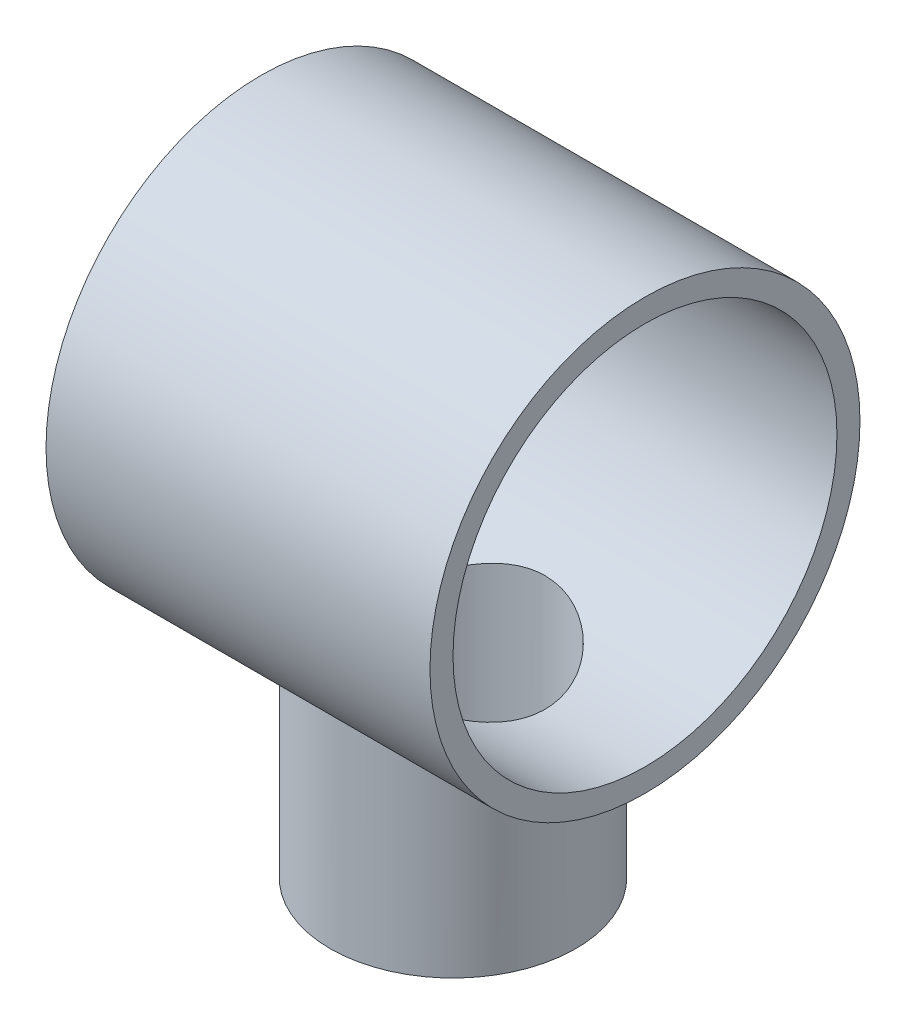
ISO-10303-21;
HEADER;
FILE_DESCRIPTION(('STEP AP214'),'2;1');
FILE_NAME('part.step','',(''),(''),'','','');
FILE_SCHEMA(('AUTOMOTIVE_DESIGN { 1 0 10303 214 1 1 1 1 }'));
ENDSEC;
DATA;
#1=APPLICATION_CONTEXT('core data for automotive mechanical design processes');
#2=APPLICATION_PROTOCOL_DEFINITION('international standard','automotive_design',2000,#1);
#3=PRODUCT_CONTEXT('',#1,'mechanical');
#4=PRODUCT('Part','Part','',(#3));
#5=PRODUCT_RELATED_PRODUCT_CATEGORY('part','',(#4));
#6=PRODUCT_DEFINITION_FORMATION('','',#4);
#7=PRODUCT_DEFINITION_CONTEXT('part definition',#1,'design');
#8=PRODUCT_DEFINITION('design','',#6,#7);
#9=PRODUCT_DEFINITION_SHAPE('','',#8);
#10=(LENGTH_UNIT() NAMED_UNIT(*) SI_UNIT(.MILLI.,.METRE.));
#11=(NAMED_UNIT(*) PLANE_ANGLE_UNIT() SI_UNIT($,.RADIAN.));
#12=(NAMED_UNIT(*) SI_UNIT($,.STERADIAN.) SOLID_ANGLE_UNIT());
#13=UNCERTAINTY_MEASURE_WITH_UNIT(LENGTH_MEASURE(1.E-05),#10,'distance_accuracy_value','');
#14=(GEOMETRIC_REPRESENTATION_CONTEXT(3) GLOBAL_UNCERTAINTY_ASSIGNED_CONTEXT((#13)) GLOBAL_UNIT_ASSIGNED_CONTEXT((#10,
#11,#12)) REPRESENTATION_CONTEXT('',''));
#15=CARTESIAN_POINT('',(0.,0.,0.));
#16=DIRECTION('',(0.,0.,1.));
#17=DIRECTION('',(1.,0.,0.));
#18=AXIS2_PLACEMENT_3D('',#15,#16,#17);
#19=CARTESIAN_POINT('',(12.5,15.,0.));
#20=DIRECTION('',(-1.,0.,0.));
#21=DIRECTION('',(0.,0.,1.));
#22=AXIS2_PLACEMENT_3D('',#19,#20,#21);
#23=CYLINDRICAL_SURFACE('',#22,12.5);
#24=CARTESIAN_POINT('',(-12.5,15.,0.));
#25=DIRECTION('',(1.,0.,0.));
#26=DIRECTION('',(0.,0.,-1.));
#27=AXIS2_PLACEMENT_3D('',#24,#25,#26);
#28=CIRCLE('',#27,12.5);
#29=CARTESIAN_POINT('',(-12.5,15.,-12.5));
#30=VERTEX_POINT('',#29);
#31=EDGE_CURVE('E93',#30,#30,#28,.T.);
#32=ORIENTED_EDGE('',*,*,#31,.F.);
#33=EDGE_LOOP('',(#32));
#34=FACE_BOUND('',#33,.T.);
#35=CARTESIAN_POINT('',(12.5,15.,0.));
#36=DIRECTION('',(1.,0.,0.));
#37=DIRECTION('',(0.,0.,-1.));
#38=AXIS2_PLACEMENT_3D('',#35,#36,#37);
#39=CIRCLE('',#38,12.5);
#40=CARTESIAN_POINT('',(12.5,15.,-12.5));
#41=VERTEX_POINT('',#40);
#42=EDGE_CURVE('E97',#41,#41,#39,.T.);
#43=ORIENTED_EDGE('',*,*,#42,.T.);
#44=EDGE_LOOP('',(#43));
#45=FACE_BOUND('',#44,.T.);
#46=CARTESIAN_POINT('',(0.,4.03414390026935,-6.));
#47=CARTESIAN_POINT('',(0.15735020462607,4.03414258662987,-5.9999989403592));
#48=CARTESIAN_POINT('',(0.314725323281396,4.03074545178164,-5.99380169491937));
#49=CARTESIAN_POINT('',(0.62828134733471,4.01727829153427,-5.96908835868027));
#50=CARTESIAN_POINT('',(0.784461596267611,4.00720483194597,-5.95056592799333));
#51=CARTESIAN_POINT('',(1.09463141883828,3.98073051054225,-5.90139633605082));
#52=CARTESIAN_POINT('',(1.24861675299921,3.96431877355168,-5.87072833318681));
#53=CARTESIAN_POINT('',(1.55308874631255,3.92573880903799,-5.79762400573589));
#54=CARTESIAN_POINT('',(1.7035738678318,3.9035681017771,-5.7551826111433));
#55=CARTESIAN_POINT('',(1.99922231074165,3.85433894593289,-5.65925128836182));
#56=CARTESIAN_POINT('',(2.14441024200026,3.82730789983292,-5.60582307265198));
#57=CARTESIAN_POINT('',(2.42954979976098,3.76909617352703,-5.48826947962813));
#58=CARTESIAN_POINT('',(2.5694993825369,3.73791389491042,-5.42413997941681));
#59=CARTESIAN_POINT('',(2.98028759703964,3.6394734410903,-5.21650106580777));
#60=CARTESIAN_POINT('',(3.24236804904727,3.56726833283627,-5.05764213495337));
#61=CARTESIAN_POINT('',(3.75692575927316,3.41122513087248,-4.68968805895476));
#62=CARTESIAN_POINT('',(4.00717460405046,3.32692019647806,-4.47770058325217));
#63=CARTESIAN_POINT('',(4.47040420543608,3.15990599648418,-4.01527636064614));
#64=CARTESIAN_POINT('',(4.68336756995255,3.07719749147101,-3.7648217721811));
#65=CARTESIAN_POINT('',(4.97662816777367,2.95806367588601,-3.3561404439229));
#66=CARTESIAN_POINT('',(5.0723081112677,2.91812142660984,-3.20973647251352));
#67=CARTESIAN_POINT('',(5.25088592279197,2.84206968239774,-2.90840580813487));
#68=CARTESIAN_POINT('',(5.33378883393528,2.80595867702705,-2.7534825106847));
#69=CARTESIAN_POINT('',(5.48600563947057,2.73861344985487,-2.43612706621973));
#70=CARTESIAN_POINT('',(5.55532260649822,2.70737812568157,-2.27369662733484));
#71=CARTESIAN_POINT('',(5.67962367137569,2.65070600181573,-1.94246064388774));
#72=CARTESIAN_POINT('',(5.7346091538641,2.62526864198179,-1.77365571700319));
#73=CARTESIAN_POINT('',(5.826405060529,2.58245349652283,-1.44241162227704));
#74=CARTESIAN_POINT('',(5.86417993521471,2.56465268360627,-1.28029410404222));
#75=CARTESIAN_POINT('',(5.92618388822962,2.53529351946516,-0.952936943564089));
#76=CARTESIAN_POINT('',(5.95041416789157,2.52373461462001,-0.78769757955608));
#77=CARTESIAN_POINT('',(5.98501257685932,2.50719628797283,-0.455519387831638));
#78=CARTESIAN_POINT('',(5.99538682662696,2.50221396118737,-0.288581343309991));
#79=CARTESIAN_POINT('',(6.00215372137931,2.49896648265721,0.0456393761256057));
#80=CARTESIAN_POINT('',(5.99854713571307,2.50070096129455,0.212922031569714));
#81=CARTESIAN_POINT('',(5.97825796713082,2.51042433268341,0.532946340185345));
#82=CARTESIAN_POINT('',(5.96265256140748,2.51789793695426,0.685773431575039));
#83=CARTESIAN_POINT('',(5.91983643540491,2.53829431925788,0.989474383570441));
#84=CARTESIAN_POINT('',(5.89262202438552,2.55121883023055,1.14034760727098));
#85=CARTESIAN_POINT('',(5.8268870747086,2.58219930718519,1.43901403468184));
#86=CARTESIAN_POINT('',(5.78837030408503,2.60025356292511,1.58680824732854));
#87=CARTESIAN_POINT('',(5.70039456377726,2.64107688093668,1.87848853904261));
#88=CARTESIAN_POINT('',(5.65093140948583,2.66384774607024,2.02237309983798));
#89=CARTESIAN_POINT('',(5.54073945498275,2.71393675191641,2.30735064119701));
#90=CARTESIAN_POINT('',(5.47986124645501,2.74131463899088,2.44837537939449));
#91=CARTESIAN_POINT('',(5.34782362295238,2.7997655230885,2.72475137236966));
#92=CARTESIAN_POINT('',(5.27666048254633,2.83083985832267,2.86010054831434));
#93=CARTESIAN_POINT('',(5.04852280088727,2.92860277505351,3.25657289688957));
#94=CARTESIAN_POINT('',(4.87683272874413,2.99986285519544,3.50829346273011));
#95=CARTESIAN_POINT('',(4.48181161499767,3.15513809245727,4.0028005901561));
#96=CARTESIAN_POINT('',(4.25524705226196,3.23972399066333,4.24280468345822));
#97=CARTESIAN_POINT('',(3.76539302870661,3.40795990378299,4.68296321169405));
#98=CARTESIAN_POINT('',(3.50207932947968,3.49160926132988,4.8830911325056));
#99=CARTESIAN_POINT('',(3.07607767123689,3.6117479406751,5.15444213727199));
#100=CARTESIAN_POINT('',(2.92453789825034,3.65186504702532,5.24193052670976));
#101=CARTESIAN_POINT('',(2.61359407813478,3.72799114778489,5.40368332335519));
#102=CARTESIAN_POINT('',(2.45419337013432,3.76400186531784,5.47795328467305));
#103=CARTESIAN_POINT('',(2.12860060881331,3.83059698579987,5.6124930249832));
#104=CARTESIAN_POINT('',(1.96241238098292,3.86118439482207,5.67277056556802));
#105=CARTESIAN_POINT('',(1.62436581887298,3.91574250864144,5.77864952753983));
#106=CARTESIAN_POINT('',(1.45250819494715,3.93971403888431,5.82425277991684));
#107=CARTESIAN_POINT('',(1.1179213473759,3.97846237464294,5.89722656483261));
#108=CARTESIAN_POINT('',(0.955503803238798,3.99380365227028,5.92572779475059));
#109=CARTESIAN_POINT('',(0.628369900268947,4.0173660938251,5.96928561814754));
#110=CARTESIAN_POINT('',(0.463653787593181,4.02558801431833,5.98434364022575));
#111=CARTESIAN_POINT('',(0.133416055698985,4.03457396457975,6.00079330547564));
#112=CARTESIAN_POINT('',(-0.032105139957409,4.0353415642635,6.00219149042094));
#113=CARTESIAN_POINT('',(-0.362556595830525,4.02939554927175,5.99131684178549));
#114=CARTESIAN_POINT('',(-0.527486888455427,4.02268235138381,5.9790447698338));
#115=CARTESIAN_POINT('',(-0.839366462674833,4.00305909519196,5.94286647113808));
#116=CARTESIAN_POINT('',(-0.986504817067181,3.99081503470986,5.92020747316513));
#117=CARTESIAN_POINT('',(-1.2781980435407,3.96085443779515,5.8641516929655));
#118=CARTESIAN_POINT('',(-1.4227520956408,3.94313619593543,5.83075156431293));
#119=CARTESIAN_POINT('',(-1.70833174204548,3.90277420250608,5.75356170859334));
#120=CARTESIAN_POINT('',(-1.84935783652694,3.88013115361543,5.7097734636378));
#121=CARTESIAN_POINT('',(-2.12715887479583,3.83057354278211,5.61221023485981));
#122=CARTESIAN_POINT('',(-2.26393214193383,3.80365732107518,5.55843136914396));
#123=CARTESIAN_POINT('',(-2.67918125236911,3.71492736599271,5.37733787957185));
#124=CARTESIAN_POINT('',(-2.94950225390146,3.64707127948246,5.23379477432826));
#125=CARTESIAN_POINT('',(-3.46356930881883,3.50281960490528,4.9088140325432));
#126=CARTESIAN_POINT('',(-3.70730186434111,3.42641971898942,4.72735728381324));
#127=CARTESIAN_POINT('',(-4.19069898944806,3.26311445540254,4.30717257677326));
#128=CARTESIAN_POINT('',(-4.4267157326711,3.17600626425688,4.0642695252742));
#129=CARTESIAN_POINT('',(-4.74821977691898,3.05069614967934,3.67193719708452));
#130=CARTESIAN_POINT('',(-4.85002570385915,3.00979217256557,3.53639517654306));
#131=CARTESIAN_POINT('',(-5.04212953563963,2.93080768352525,3.25663542499984));
#132=CARTESIAN_POINT('',(-5.13243236660451,2.89272596592658,3.11242144691999));
#133=CARTESIAN_POINT('',(-5.30245649091858,2.81968660411802,2.81320982661953));
#134=CARTESIAN_POINT('',(-5.38193634820776,2.7848046078058,2.65805646337679));
#135=CARTESIAN_POINT('',(-5.52738616675632,2.72002611871248,2.34061158696014));
#136=CARTESIAN_POINT('',(-5.59336206342739,2.69012743668706,2.17832324809829));
#137=CARTESIAN_POINT('',(-5.71108011912281,2.63619401478782,1.84778988524713));
#138=CARTESIAN_POINT('',(-5.76282835952442,2.6121567700376,1.67954744105962));
#139=CARTESIAN_POINT('',(-5.85147207077611,2.57067226939143,1.33840310803469));
#140=CARTESIAN_POINT('',(-5.88836913329155,2.55322430730576,1.1655017206368));
#141=CARTESIAN_POINT('',(-5.94426628654407,2.52667827795417,0.831739984168317));
#142=CARTESIAN_POINT('',(-5.96454345383424,2.51698615115047,0.671139677472094));
#143=CARTESIAN_POINT('',(-5.99205223543775,2.50381889630845,0.348575735762495));
#144=CARTESIAN_POINT('',(-5.99928472887483,2.50034334931438,0.186612193361238));
#145=CARTESIAN_POINT('',(-6.00061410915846,2.49970520827725,-0.137338693741288));
#146=CARTESIAN_POINT('',(-5.9947143063805,2.50254102327264,-0.299326022153729));
#147=CARTESIAN_POINT('',(-5.9698602432579,2.51444386337725,-0.622061977662451));
#148=CARTESIAN_POINT('',(-5.95090625534433,2.52351075844848,-0.782810630538171));
#149=CARTESIAN_POINT('',(-5.90164730665827,2.54692799667654,-1.0925722343886));
#150=CARTESIAN_POINT('',(-5.87206264345968,2.56094224978832,-1.24172602322374));
#151=CARTESIAN_POINT('',(-5.8018111212944,2.59395101516232,-1.53688358028895));
#152=CARTESIAN_POINT('',(-5.76114070631744,2.61294712539583,-1.68288632150236));
#153=CARTESIAN_POINT('',(-5.66911874453989,2.65547728554647,-1.97076512517666));
#154=CARTESIAN_POINT('',(-5.61777003428042,2.67901013022211,-2.11264227215943));
#155=CARTESIAN_POINT('',(-5.50483662515281,2.7300895424073,-2.39153591304959));
#156=CARTESIAN_POINT('',(-5.44324801340995,2.75763764372984,-2.52855052450365));
#157=CARTESIAN_POINT('',(-5.23793980565394,2.84803012801514,-2.94306911458783));
#158=CARTESIAN_POINT('',(-5.07772449605671,2.91668708637703,-3.21136402090248));
#159=CARTESIAN_POINT('',(-4.71921395006413,3.06290486167362,-3.71828223796427));
#160=CARTESIAN_POINT('',(-4.52090126857919,3.14046975105138,-3.95689187280019));
#161=CARTESIAN_POINT('',(-4.07049414406464,3.30508858643697,-4.42098007535831));
#162=CARTESIAN_POINT('',(-3.81512487482606,3.3923575034469,-4.64321301880738));
#163=CARTESIAN_POINT('',(-3.26880459586111,3.5602552875519,-5.04275327593884));
#164=CARTESIAN_POINT('',(-2.97782637035229,3.64087899598651,-5.22002590468109));
#165=CARTESIAN_POINT('',(-2.51665464445101,3.7500873489084,-5.44948094716765));
#166=CARTESIAN_POINT('',(-2.35701681681534,3.78483365899694,-5.52043095343247));
#167=CARTESIAN_POINT('',(-2.03121585120839,3.84874986659495,-5.64842816908365));
#168=CARTESIAN_POINT('',(-1.86505610352782,3.87792261631825,-5.70548249357618));
#169=CARTESIAN_POINT('',(-1.52785027504165,3.92947020162007,-5.80486878048079));
#170=CARTESIAN_POINT('',(-1.3568181694819,3.95186268494729,-5.84723900516207));
#171=CARTESIAN_POINT('',(-1.01097044741679,3.98897996729627,-5.91684094677842));
#172=CARTESIAN_POINT('',(-0.836157643260832,4.00371027460589,-5.9440835398224));
#173=CARTESIAN_POINT('',(-0.550800101530248,4.02086489980565,-5.97568127307846));
#174=CARTESIAN_POINT('',(-0.440908951821442,4.02583561794815,-5.98479428505624));
#175=CARTESIAN_POINT('',(-0.220682635552664,4.03247567245486,-5.99695419216154));
#176=CARTESIAN_POINT('',(-0.110347444155998,4.03414482150589,-6.00000074311091));
#177=CARTESIAN_POINT('',(0.,4.03414390026935,-6.));
#178=B_SPLINE_CURVE_WITH_KNOTS('',3,(#46,#47,#48,#49,#50,#51,#52,#53,#54,#55,#56,#57,#58,#59,
#60,#61,#62,#63,#64,#65,#66,#67,#68,#69,#70,#71,#72,#73,#74,#75,#76,#77,#78,#79,#80,#81,#82,#83,
#84,#85,#86,#87,#88,#89,#90,#91,#92,#93,#94,#95,#96,#97,#98,#99,#100,#101,#102,#103,#104,#105,
#106,#107,#108,#109,#110,#111,#112,#113,#114,#115,#116,#117,#118,#119,#120,#121,#122,#123,#124,
#125,#126,#127,#128,#129,#130,#131,#132,#133,#134,#135,#136,#137,#138,#139,#140,#141,#142,#143,
#144,#145,#146,#147,#148,#149,#150,#151,#152,#153,#154,#155,#156,#157,#158,#159,#160,#161,#162,
#163,#164,#165,#166,#167,#168,#169,#170,#171,#172,#173,#174,#175,#176,#177),.UNSPECIFIED.,.T.,
.F.,(4,2,2,2,2,2,2,2,2,2,2,2,2,2,2,2,2,2,2,2,2,2,2,2,2,2,2,2,2,2,2,2,2,2,2,2,2,2,2,2,2,2,2,2,2,
2,2,2,2,2,2,2,2,2,2,2,2,2,2,2,2,2,2,2,2,4),(0.,0.471936590147493,0.944116125143456,
1.41710944807336,1.89030677436769,2.36091541882663,2.83170579566572,3.77232944848345,
4.78415072006602,5.79644271304576,6.33405924599547,6.87146303446902,7.40874514157362,
7.94597531982624,8.44753067538701,8.94904153862282,9.45033080199234,9.95159248039024,
10.4124589956264,10.8734721390776,11.3343317620708,11.7953678687484,12.2629231066265,
12.7306481298597,13.6655405997409,14.683524718929,15.7021834650795,16.2401629947783,
16.7779159401748,17.3153698775199,17.8527567278132,18.3489008146548,18.8449921703721,
19.3408459334671,19.8366720717883,20.2842881949034,20.732043909255,21.1797357789998,
21.6276019663289,22.5639579194149,23.5007870313311,24.5446739907422,25.0673281518587,
25.589757731908,26.1224027734003,26.6548131956594,27.1869956928083,27.7191211384468,
28.2049834763956,28.6908130692503,29.1765202085596,29.6622172118322,30.119809042876,
30.5775478301311,31.0351651803853,31.492957799133,32.4484547466443,33.4043902712219,
34.4485727225206,35.4935582818586,36.0272882712014,36.5607443936444,37.0927998531633,
37.6244722910452,37.9554158848919,38.2863782541512),.UNSPECIFIED.);
#179=CARTESIAN_POINT('',(0.,4.03414390026935,-6.));
#180=VERTEX_POINT('',#179);
#181=EDGE_CURVE('E40',#180,#180,#178,.T.);
#182=ORIENTED_EDGE('',*,*,#181,.T.);
#183=EDGE_LOOP('',(#182));
#184=FACE_BOUND('',#183,.T.);
#185=ADVANCED_FACE('F35',(#34,#45,#184),#23,.F.);
#186=CARTESIAN_POINT('',(0.,-10.,0.));
#187=DIRECTION('',(0.,1.,0.));
#188=DIRECTION('',(0.,0.,1.));
#189=AXIS2_PLACEMENT_3D('',#186,#187,#188);
#190=CYLINDRICAL_SURFACE('',#189,8.);
#191=CARTESIAN_POINT('',(0.,-10.,0.));
#192=DIRECTION('',(0.,1.,0.));
#193=DIRECTION('',(0.,0.,1.));
#194=AXIS2_PLACEMENT_3D('',#191,#192,#193);
#195=CIRCLE('',#194,8.);
#196=CARTESIAN_POINT('',(0.,-10.,8.));
#197=VERTEX_POINT('',#196);
#198=EDGE_CURVE('E10',#197,#197,#195,.T.);
#199=ORIENTED_EDGE('',*,*,#198,.T.);
#200=EDGE_LOOP('',(#199));
#201=FACE_BOUND('',#200,.T.);
#202=CARTESIAN_POINT('',(0.,3.51087470692394,8.));
#203=CARTESIAN_POINT('',(-0.203532053407668,3.51087379464103,7.99999935787318));
#204=CARTESIAN_POINT('',(-0.407073236896617,3.50544619430501,7.99222093739566));
#205=CARTESIAN_POINT('',(-0.812412823952546,3.48396610627577,7.96123805270269));
#206=CARTESIAN_POINT('',(-1.01421110702202,3.46791288983113,7.93803253042836));
#207=CARTESIAN_POINT('',(-1.4145701364248,3.42583301533682,7.87655003429313));
#208=CARTESIAN_POINT('',(-1.61312857682094,3.39979955132071,7.8382627750462));
#209=CARTESIAN_POINT('',(-2.00554935264564,3.33875530965615,7.74715252449393));
#210=CARTESIAN_POINT('',(-2.19940947513382,3.3037403882863,7.69432282300342));
#211=CARTESIAN_POINT('',(-2.57985185857755,3.22625029389712,7.57521099426554));
#212=CARTESIAN_POINT('',(-2.76647556850952,3.18382906375657,7.50902563226831));
#213=CARTESIAN_POINT('',(-3.13304164710548,3.09267407409629,7.36362364874681));
#214=CARTESIAN_POINT('',(-3.31298150287958,3.04393797070776,7.28440218569752));
#215=CARTESIAN_POINT('',(-3.66542399476786,2.94152178198397,7.11357880853858));
#216=CARTESIAN_POINT('',(-3.83792662498148,2.88784169272634,7.0219768846067));
#217=CARTESIAN_POINT('',(-4.17487753896861,2.7768951985415,6.82702919645341));
#218=CARTESIAN_POINT('',(-4.33932554802266,2.719628671443,6.72368303206903));
#219=CARTESIAN_POINT('',(-4.85512715378479,2.53153711631994,6.37278986898853));
#220=CARTESIAN_POINT('',(-5.19015691201354,2.39607788981852,6.10292894790177));
#221=CARTESIAN_POINT('',(-5.65709874957143,2.19441205704438,5.66068633058366));
#222=CARTESIAN_POINT('',(-5.8068988109526,2.12740047760913,5.50691703469408));
#223=CARTESIAN_POINT('',(-6.09411167367843,1.99531120705491,5.18728463853358));
#224=CARTESIAN_POINT('',(-6.23152231757581,1.93023385407252,5.02141944098826));
#225=CARTESIAN_POINT('',(-6.50554543728718,1.7974846511613,4.66194414007324));
#226=CARTESIAN_POINT('',(-6.64083423348208,1.73015645261398,4.46719629801406));
#227=CARTESIAN_POINT('',(-6.89430417359594,1.60151079680771,4.06509696496219));
#228=CARTESIAN_POINT('',(-7.01249286079677,1.54019069310648,3.85775108894336));
#229=CARTESIAN_POINT('',(-7.23055274761404,1.42530638572575,3.43166945278214));
#230=CARTESIAN_POINT('',(-7.33043072437354,1.37173931405297,3.21293794532071));
#231=CARTESIAN_POINT('',(-7.51064770539245,1.27396287079271,2.76555609989002));
#232=CARTESIAN_POINT('',(-7.59098956002278,1.22975213421385,2.53690721463525));
#233=CARTESIAN_POINT('',(-7.72476414227543,1.155536498936,2.09214757578943));
#234=CARTESIAN_POINT('',(-7.77994757071751,1.12462140717523,1.87671473758834));
#235=CARTESIAN_POINT('',(-7.87232827155107,1.07261363962332,1.44085379358994));
#236=CARTESIAN_POINT('',(-7.90952651253797,1.051520434875,1.22042595746858));
#237=CARTESIAN_POINT('',(-7.96535104349289,1.01978934406538,0.776637541640427));
#238=CARTESIAN_POINT('',(-7.98399021237239,1.00914420772851,0.553279104804045));
#239=CARTESIAN_POINT('',(-8.00244019334801,0.998607631082948,0.1055402067639));
#240=CARTESIAN_POINT('',(-8.00225266669156,0.998715241963364,-0.118840162518517));
#241=CARTESIAN_POINT('',(-7.98414707920388,1.00905416457443,-0.541204837191634));
#242=CARTESIAN_POINT('',(-7.96823470319758,1.01814027251801,-0.73930714059531));
#243=CARTESIAN_POINT('',(-7.92181138722078,1.04454481076611,-1.13324065436717));
#244=CARTESIAN_POINT('',(-7.89130043387898,1.06186324861087,-1.32907186265503));
#245=CARTESIAN_POINT('',(-7.81604849532753,1.10432978236291,-1.71710436673406));
#246=CARTESIAN_POINT('',(-7.7713077055348,1.12947777074764,-1.90930571233539));
#247=CARTESIAN_POINT('',(-7.66810063771136,1.1870374415722,-2.28886889231524));
#248=CARTESIAN_POINT('',(-7.60963381127433,1.21944941423292,-2.47623053299741));
#249=CARTESIAN_POINT('',(-7.47900716263506,1.29115106207804,-2.84663676312752));
#250=CARTESIAN_POINT('',(-7.40673374101656,1.3304975699406,-3.02963027125491));
#251=CARTESIAN_POINT('',(-7.24949489961241,1.41505255528151,-3.38869989028848));
#252=CARTESIAN_POINT('',(-7.16452522955536,1.46026299513312,-3.56477365967584));
#253=CARTESIAN_POINT('',(-6.89160511352056,1.60335483813559,-4.08133031913795));
#254=CARTESIAN_POINT('',(-6.68555941397723,1.70874420981498,-4.41038459232624));
#255=CARTESIAN_POINT('',(-6.20500486063072,1.94422317826825,-5.06776505827329));
#256=CARTESIAN_POINT('',(-5.92538970670998,2.07575822213147,-5.39180398545108));
#257=CARTESIAN_POINT('',(-5.31861496648541,2.34245839410243,-5.99118151021044));
#258=CARTESIAN_POINT('',(-4.99139778935492,2.4776277553338,-6.26646020813504));
#259=CARTESIAN_POINT('',(-4.45186805957325,2.67978592544126,-6.65103180993463));
#260=CARTESIAN_POINT('',(-4.25405365200772,2.75010093222671,-6.77929998321682));
#261=CARTESIAN_POINT('',(-3.84645994234112,2.88561536198298,-7.01858679330554));
#262=CARTESIAN_POINT('',(-3.636678986944,2.95081407511703,-7.12960303865946));
#263=CARTESIAN_POINT('',(-3.20656525649659,3.07357348897836,-7.33310792125623));
#264=CARTESIAN_POINT('',(-2.98624839758995,3.13114524445821,-7.42562347538946));
#265=CARTESIAN_POINT('',(-2.53612621066356,3.23632164384519,-7.5911464410266));
#266=CARTESIAN_POINT('',(-2.30632423255972,3.28392977120957,-7.66416067300526));
#267=CARTESIAN_POINT('',(-1.89252039423351,3.35739852829574,-7.77516436521671));
#268=CARTESIAN_POINT('',(-1.71007365481322,3.38574272375907,-7.81734535237598));
#269=CARTESIAN_POINT('',(-1.34163095600317,3.43424646863062,-7.88893043075294));
#270=CARTESIAN_POINT('',(-1.1556357000427,3.45440762288626,-7.9183370273471));
#271=CARTESIAN_POINT('',(-0.781435661011515,3.48583857464747,-7.96397245724534));
#272=CARTESIAN_POINT('',(-0.593232752289644,3.49711542882128,-7.98021174944457));
#273=CARTESIAN_POINT('',(-0.215813154775263,3.51039546511248,-7.99932030628691));
#274=CARTESIAN_POINT('',(-0.0265964402724154,3.51239841091635,-8.0021892302324));
#275=CARTESIAN_POINT('',(0.351536747347504,3.50705359322876,-7.99451086101233));
#276=CARTESIAN_POINT('',(0.540452991603117,3.4997005673916,-7.98395601753633));
#277=CARTESIAN_POINT('',(0.91648864933987,3.47590630372614,-7.94957218731959));
#278=CARTESIAN_POINT('',(1.10360805614218,3.4594650321302,-7.92574315125822));
#279=CARTESIAN_POINT('',(1.4748504810553,3.41806865447064,-7.86512609591677));
#280=CARTESIAN_POINT('',(1.65897219136489,3.39310993154899,-7.82833257116862));
#281=CARTESIAN_POINT('',(2.02309893055683,3.33549888222521,-7.74222786397832));
#282=CARTESIAN_POINT('',(2.20310226698274,3.30284345300226,-7.69291163255808));
#283=CARTESIAN_POINT('',(2.56014186927809,3.23040367796561,-7.58162634041831));
#284=CARTESIAN_POINT('',(2.73711631366741,3.19053822997567,-7.51951208171788));
#285=CARTESIAN_POINT('',(3.08510370035704,3.1050688041901,-7.38356659760344));
#286=CARTESIAN_POINT('',(3.2561146534028,3.05946293449649,-7.30973150719449));
#287=CARTESIAN_POINT('',(3.75919663013387,2.91578265828223,-7.07149845059396));
#288=CARTESIAN_POINT('',(4.08148223858302,2.81081016630328,-6.89032049811624));
#289=CARTESIAN_POINT('',(4.74708039356009,2.57331769208962,-6.45360047243513));
#290=CARTESIAN_POINT('',(5.08498077215181,2.43911930002394,-6.19070291613562));
#291=CARTESIAN_POINT('',(5.55721923537886,2.23824257410359,-5.75872693500357));
#292=CARTESIAN_POINT('',(5.70896330203836,2.17130419071854,-5.60833747142739));
#293=CARTESIAN_POINT('',(6.00031844335092,2.03902192635771,-5.29545640963524));
#294=CARTESIAN_POINT('',(6.13992750951447,1.97367831061762,-5.1329628162727));
#295=CARTESIAN_POINT('',(6.41954655925782,1.83967907616953,-4.7796591808956));
#296=CARTESIAN_POINT('',(6.55819250170972,1.77134854579868,-4.58764366412883));
#297=CARTESIAN_POINT('',(6.81862006974241,1.64032479437001,-4.19078930808789));
#298=CARTESIAN_POINT('',(6.94040891032178,1.57762916557544,-3.98595600979688));
#299=CARTESIAN_POINT('',(7.16592944295129,1.45964134126444,-3.56462133850448));
#300=CARTESIAN_POINT('',(7.26966741483986,1.40434657256427,-3.34812405783079));
#301=CARTESIAN_POINT('',(7.4578608754276,1.30279557886883,-2.90486806319763));
#302=CARTESIAN_POINT('',(7.54231902946557,1.25653810464022,-2.67811077283313));
#303=CARTESIAN_POINT('',(7.68470327125659,1.17786409832914,-2.23495150028006));
#304=CARTESIAN_POINT('',(7.74422941721163,1.14462743132597,-2.01920900668025));
#305=CARTESIAN_POINT('',(7.84517248377933,1.08795548261667,-1.58225574682243));
#306=CARTESIAN_POINT('',(7.88659026348183,1.06451973594152,-1.36104524050185));
#307=CARTESIAN_POINT('',(7.9506621926545,1.02815926363848,-0.915231256113877));
#308=CARTESIAN_POINT('',(7.97333016451953,1.01522679510116,-0.690630402022283));
#309=CARTESIAN_POINT('',(7.99958432343561,1.0002418127116,-0.239962292564943));
#310=CARTESIAN_POINT('',(8.00317236837154,0.998188239540133,-0.0138951821205331));
#311=CARTESIAN_POINT('',(7.99191519532132,1.00461862963469,0.411213692102206));
#312=CARTESIAN_POINT('',(7.97917029839166,1.01190195905496,0.610333417577633));
#313=CARTESIAN_POINT('',(7.93891865448037,1.0348235295094,1.00659085045482));
#314=CARTESIAN_POINT('',(7.9114119916168,1.05046172293442,1.20372856914427));
#315=CARTESIAN_POINT('',(7.84197563237113,1.08972453689223,1.59462422714616));
#316=CARTESIAN_POINT('',(7.80004631482464,1.11334894765314,1.78838225509149));
#317=CARTESIAN_POINT('',(7.70224921064393,1.16804418693653,2.17126841657162));
#318=CARTESIAN_POINT('',(7.64638091449672,1.19911528765705,2.36039638058562));
#319=CARTESIAN_POINT('',(7.52120320673822,1.26807504709626,2.73316739886784));
#320=CARTESIAN_POINT('',(7.45187545532424,1.30597300292072,2.9168025701305));
#321=CARTESIAN_POINT('',(7.30048147046163,1.38776334061494,3.27738544473062));
#322=CARTESIAN_POINT('',(7.21841099052155,1.43165772019414,3.45433089419764));
#323=CARTESIAN_POINT('',(6.95410784171073,1.57103555761302,3.97380675992894));
#324=CARTESIAN_POINT('',(6.75369990451323,1.67426099699949,4.30522274065944));
#325=CARTESIAN_POINT('',(6.28553010956127,1.90565090019005,4.96733530069146));
#326=CARTESIAN_POINT('',(6.01278689899851,2.03530937455676,5.29395096324924));
#327=CARTESIAN_POINT('',(5.41983313755051,2.29944562615075,5.89958284052368));
#328=CARTESIAN_POINT('',(5.09956597221793,2.4339290043005,6.17854141763025));
#329=CARTESIAN_POINT('',(4.56996211836063,2.63657458482188,6.57042581834852));
#330=CARTESIAN_POINT('',(4.37506830413222,2.70750013246499,6.70181247889628));
#331=CARTESIAN_POINT('',(3.97318365265761,2.84473287876834,6.94760836068724));
#332=CARTESIAN_POINT('',(3.76619109693042,2.911039418408,7.06201516193754));
#333=CARTESIAN_POINT('',(3.34144266603002,3.03654994116394,7.27261222633194));
#334=CARTESIAN_POINT('',(3.1237017019465,3.09576339394526,7.36882687861749));
#335=CARTESIAN_POINT('',(2.67846089151758,3.20476212403586,7.54207213091617));
#336=CARTESIAN_POINT('',(2.45096438657844,3.25455059838864,7.61910923894073));
#337=CARTESIAN_POINT('',(2.0411690044133,3.33227912442775,7.73744636878641));
#338=CARTESIAN_POINT('',(1.86051050776771,3.36261048049434,7.78289066379238));
#339=CARTESIAN_POINT('',(1.49536820145675,3.41537578430849,7.86121615302245));
#340=CARTESIAN_POINT('',(1.31088515013274,3.43781128210172,7.89409981314857));
#341=CARTESIAN_POINT('',(0.939368878356907,3.47401765215356,7.94687101669033));
#342=CARTESIAN_POINT('',(0.752337775378022,3.48779531811281,7.96676875048649));
#343=CARTESIAN_POINT('',(0.376873794354804,3.50622461633005,7.99333404464275));
#344=CARTESIAN_POINT('',(0.188440810349482,3.51087555156403,8.0000005945152));
#345=CARTESIAN_POINT('',(0.,3.51087470692394,8.));
#346=B_SPLINE_CURVE_WITH_KNOTS('',3,(#202,#203,#204,#205,#206,#207,#208,#209,#210,#211,#212,
#213,#214,#215,#216,#217,#218,#219,#220,#221,#222,#223,#224,#225,#226,#227,#228,#229,#230,#231,
#232,#233,#234,#235,#236,#237,#238,#239,#240,#241,#242,#243,#244,#245,#246,#247,#248,#249,#250,
#251,#252,#253,#254,#255,#256,#257,#258,#259,#260,#261,#262,#263,#264,#265,#266,#267,#268,#269,
#270,#271,#272,#273,#274,#275,#276,#277,#278,#279,#280,#281,#282,#283,#284,#285,#286,#287,#288,
#289,#290,#291,#292,#293,#294,#295,#296,#297,#298,#299,#300,#301,#302,#303,#304,#305,#306,#307,
#308,#309,#310,#311,#312,#313,#314,#315,#316,#317,#318,#319,#320,#321,#322,#323,#324,#325,#326,
#327,#328,#329,#330,#331,#332,#333,#334,#335,#336,#337,#338,#339,#340,#341,#342,#343,#344,#345),
.UNSPECIFIED.,.T.,.F.,(4,2,2,2,2,2,2,2,2,2,2,2,2,2,2,2,2,2,2,2,2,2,2,2,2,2,2,2,2,2,2,2,2,2,2,2,
2,2,2,2,2,2,2,2,2,2,2,2,2,2,2,2,2,2,2,2,2,2,2,2,2,2,2,2,2,2,2,2,2,2,2,4),(0.,0.610394126103379,
1.22083012005505,1.83168313959684,2.44281849325877,3.04967548542959,3.65675837123256,
4.26384173867705,4.87094579755472,6.21753747554204,6.89171864533102,7.56601698870423,
8.3045669283272,9.04279007542035,9.78073943799214,10.5185810671458,11.1912108386204,
11.8638043814644,12.5359308577257,13.2079980263196,13.8041314389816,14.4002653976618,
14.9963911700472,15.5925407639334,16.1938249441429,16.795310866662,17.9975256071594,
19.3356434097981,20.6753937960611,21.4126763910496,22.1500610967486,22.8863650392052,
23.622411125397,24.1899980120177,24.7574735303864,25.3244978556288,25.8915366294471,
26.458894480069,27.0262544387393,27.5938556220508,28.1616860185033,28.7363534334683,
29.3112107426534,30.460399270276,31.8006433834285,32.471764276011,33.1429960365511,
33.8815468318407,34.6197805364179,35.3577568961564,36.0956311724698,36.7734445402097,
37.4512257479099,38.1285068475318,38.8057219965158,39.4039821689445,40.0022389322987,
40.6004799826188,41.1987429037133,41.7978268107273,42.3971107915815,43.5948947440238,
44.9242990162921,46.2552998910702,46.991066217593,47.726937306054,48.461814749875,
49.196442467742,49.762090120445,50.3276266681383,50.8927188898653,51.4578542669702),.UNSPECIFIED.);
#347=CARTESIAN_POINT('',(0.,3.51087470692394,8.));
#348=VERTEX_POINT('',#347);
#349=EDGE_CURVE('E52',#348,#348,#346,.T.);
#350=ORIENTED_EDGE('',*,*,#349,.T.);
#351=EDGE_LOOP('',(#350));
#352=FACE_BOUND('',#351,.T.);
#353=ADVANCED_FACE('F37',(#201,#352),#190,.T.);
#354=CARTESIAN_POINT('',(0.,-10.,0.));
#355=DIRECTION('',(0.,1.,0.));
#356=DIRECTION('',(0.,0.,1.));
#357=AXIS2_PLACEMENT_3D('',#354,#355,#356);
#358=CYLINDRICAL_SURFACE('',#357,6.);
#359=CARTESIAN_POINT('',(0.,-10.,0.));
#360=DIRECTION('',(0.,1.,0.));
#361=DIRECTION('',(0.,0.,1.));
#362=AXIS2_PLACEMENT_3D('',#359,#360,#361);
#363=CIRCLE('',#362,6.);
#364=CARTESIAN_POINT('',(0.,-10.,6.));
#365=VERTEX_POINT('',#364);
#366=EDGE_CURVE('E48',#365,#365,#363,.T.);
#367=ORIENTED_EDGE('',*,*,#366,.F.);
#368=EDGE_LOOP('',(#367));
#369=FACE_BOUND('',#368,.T.);
#370=ORIENTED_EDGE('',*,*,#181,.F.);
#371=EDGE_LOOP('',(#370));
#372=FACE_BOUND('',#371,.T.);
#373=ADVANCED_FACE('F71',(#369,#372),#358,.F.);
#374=CARTESIAN_POINT('',(0.,-10.,0.));
#375=DIRECTION('',(0.,1.,0.));
#376=DIRECTION('',(0.,0.,1.));
#377=AXIS2_PLACEMENT_3D('',#374,#375,#376);
#378=PLANE('',#377);
#379=ORIENTED_EDGE('',*,*,#366,.T.);
#380=EDGE_LOOP('',(#379));
#381=FACE_BOUND('',#380,.T.);
#382=ORIENTED_EDGE('',*,*,#198,.F.);
#383=EDGE_LOOP('',(#382));
#384=FACE_BOUND('',#383,.T.);
#385=ADVANCED_FACE('F73',(#381,#384),#378,.F.);
#386=CARTESIAN_POINT('',(12.5,15.,0.));
#387=DIRECTION('',(1.,0.,0.));
#388=DIRECTION('',(0.,0.,-1.));
#389=AXIS2_PLACEMENT_3D('',#386,#387,#388);
#390=PLANE('',#389);
#391=CARTESIAN_POINT('',(12.5,15.,0.));
#392=DIRECTION('',(1.,0.,0.));
#393=DIRECTION('',(0.,0.,-1.));
#394=AXIS2_PLACEMENT_3D('',#391,#392,#393);
#395=CIRCLE('',#394,14.);
#396=CARTESIAN_POINT('',(12.5,15.,-14.));
#397=VERTEX_POINT('',#396);
#398=EDGE_CURVE('E60',#397,#397,#395,.T.);
#399=ORIENTED_EDGE('',*,*,#398,.T.);
#400=EDGE_LOOP('',(#399));
#401=FACE_BOUND('',#400,.T.);
#402=ORIENTED_EDGE('',*,*,#42,.F.);
#403=EDGE_LOOP('',(#402));
#404=FACE_BOUND('',#403,.T.);
#405=ADVANCED_FACE('F76',(#401,#404),#390,.T.);
#406=CARTESIAN_POINT('',(-12.5,15.,0.));
#407=DIRECTION('',(1.,0.,0.));
#408=DIRECTION('',(0.,0.,-1.));
#409=AXIS2_PLACEMENT_3D('',#406,#407,#408);
#410=PLANE('',#409);
#411=CARTESIAN_POINT('',(-12.5,15.,0.));
#412=DIRECTION('',(1.,0.,0.));
#413=DIRECTION('',(0.,0.,-1.));
#414=AXIS2_PLACEMENT_3D('',#411,#412,#413);
#415=CIRCLE('',#414,14.);
#416=CARTESIAN_POINT('',(-12.5,15.,-14.));
#417=VERTEX_POINT('',#416);
#418=EDGE_CURVE('E61',#417,#417,#415,.T.);
#419=ORIENTED_EDGE('',*,*,#418,.F.);
#420=EDGE_LOOP('',(#419));
#421=FACE_BOUND('',#420,.T.);
#422=ORIENTED_EDGE('',*,*,#31,.T.);
#423=EDGE_LOOP('',(#422));
#424=FACE_BOUND('',#423,.T.);
#425=ADVANCED_FACE('F68',(#421,#424),#410,.F.);
#426=CARTESIAN_POINT('',(12.5,15.,0.));
#427=DIRECTION('',(-1.,0.,0.));
#428=DIRECTION('',(0.,0.,1.));
#429=AXIS2_PLACEMENT_3D('',#426,#427,#428);
#430=CYLINDRICAL_SURFACE('',#429,14.);
#431=ORIENTED_EDGE('',*,*,#349,.F.);
#432=EDGE_LOOP('',(#431));
#433=FACE_BOUND('',#432,.T.);
#434=ORIENTED_EDGE('',*,*,#398,.F.);
#435=EDGE_LOOP('',(#434));
#436=FACE_BOUND('',#435,.T.);
#437=ORIENTED_EDGE('',*,*,#418,.T.);
#438=EDGE_LOOP('',(#437));
#439=FACE_BOUND('',#438,.T.);
#440=ADVANCED_FACE('F63',(#433,#436,#439),#430,.T.);
#441=CLOSED_SHELL('',(#185,#353,#373,#385,#405,#425,#440));
#442=MANIFOLD_SOLID_BREP('B2',#441);
#443=ADVANCED_BREP_SHAPE_REPRESENTATION('',(#18,#442),#14);
#444=SHAPE_DEFINITION_REPRESENTATION(#9,#443);
ENDSEC;
END-ISO-10303-21;
